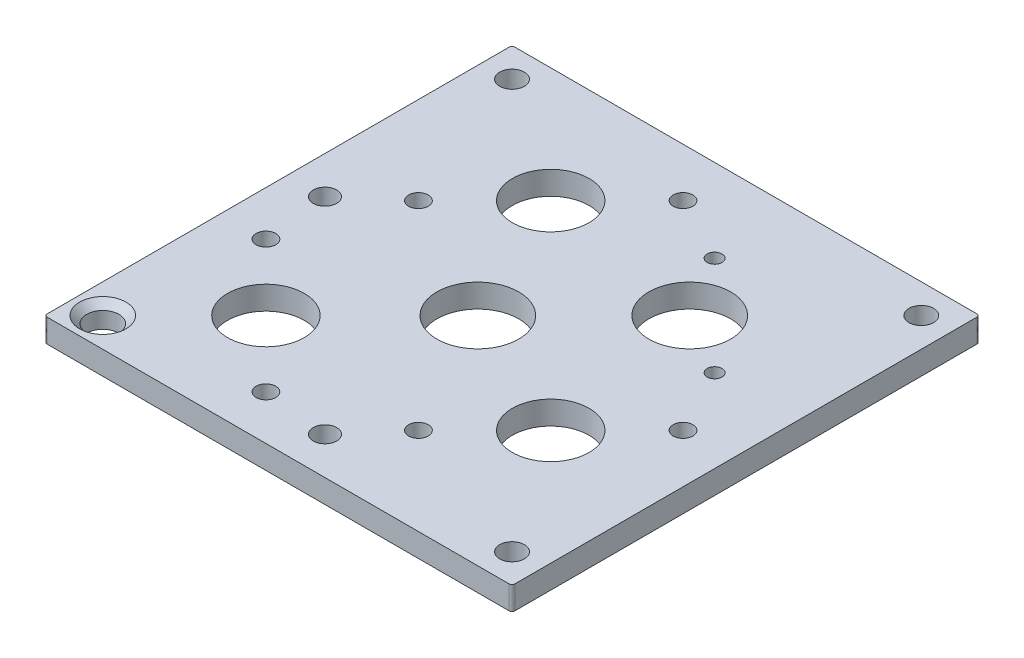
ISO-10303-21;
HEADER;
FILE_DESCRIPTION(('STEP AP214'),'2;1');
FILE_NAME('part.step','',(''),(''),'','','');
FILE_SCHEMA(('AUTOMOTIVE_DESIGN { 1 0 10303 214 1 1 1 1 }'));
ENDSEC;
DATA;
#1=APPLICATION_CONTEXT('core data for automotive mechanical design processes');
#2=APPLICATION_PROTOCOL_DEFINITION('international standard','automotive_design',2000,#1);
#3=PRODUCT_CONTEXT('',#1,'mechanical');
#4=PRODUCT('Part','Part','',(#3));
#5=PRODUCT_RELATED_PRODUCT_CATEGORY('part','',(#4));
#6=PRODUCT_DEFINITION_FORMATION('','',#4);
#7=PRODUCT_DEFINITION_CONTEXT('part definition',#1,'design');
#8=PRODUCT_DEFINITION('design','',#6,#7);
#9=PRODUCT_DEFINITION_SHAPE('','',#8);
#10=(LENGTH_UNIT() NAMED_UNIT(*) SI_UNIT(.MILLI.,.METRE.));
#11=(NAMED_UNIT(*) PLANE_ANGLE_UNIT() SI_UNIT($,.RADIAN.));
#12=(NAMED_UNIT(*) SI_UNIT($,.STERADIAN.) SOLID_ANGLE_UNIT());
#13=UNCERTAINTY_MEASURE_WITH_UNIT(LENGTH_MEASURE(1.E-05),#10,'distance_accuracy_value','');
#14=(GEOMETRIC_REPRESENTATION_CONTEXT(3) GLOBAL_UNCERTAINTY_ASSIGNED_CONTEXT((#13)) GLOBAL_UNIT_ASSIGNED_CONTEXT((#10,
#11,#12)) REPRESENTATION_CONTEXT('',''));
#15=CARTESIAN_POINT('',(0.,0.,0.));
#16=DIRECTION('',(0.,0.,1.));
#17=DIRECTION('',(1.,0.,0.));
#18=AXIS2_PLACEMENT_3D('',#15,#16,#17);
#19=CARTESIAN_POINT('',(76.3793482367758,0.762,-75.0018767002519));
#20=DIRECTION('',(0.,-1.,0.));
#21=DIRECTION('',(0.,0.,-1.));
#22=AXIS2_PLACEMENT_3D('',#19,#20,#21);
#23=PLANE('',#22);
#24=CARTESIAN_POINT('',(16.2130982367762,0.762,41.044373299748));
#25=DIRECTION('',(0.,-1.,0.));
#26=DIRECTION('',(0.,0.,-1.));
#27=AXIS2_PLACEMENT_3D('',#24,#25,#26);
#28=CIRCLE('',#27,3.175);
#29=CARTESIAN_POINT('',(16.2130982367762,0.762,37.869373299748));
#30=VERTEX_POINT('',#29);
#31=EDGE_CURVE('E633',#30,#30,#28,.F.);
#32=ORIENTED_EDGE('',*,*,#31,.F.);
#33=EDGE_LOOP('',(#32));
#34=FACE_BOUND('',#33,.T.);
#35=CARTESIAN_POINT('',(-39.6669017632242,0.762,-14.8356267002519));
#36=DIRECTION('',(0.,1.,0.));
#37=DIRECTION('',(0.,0.,1.));
#38=AXIS2_PLACEMENT_3D('',#35,#36,#37);
#39=CIRCLE('',#38,3.175);
#40=CARTESIAN_POINT('',(-39.6669017632242,0.762,-11.6606267002519));
#41=VERTEX_POINT('',#40);
#42=EDGE_CURVE('E259',#41,#41,#39,.T.);
#43=ORIENTED_EDGE('',*,*,#42,.F.);
#44=EDGE_LOOP('',(#43));
#45=FACE_BOUND('',#44,.T.);
#46=CARTESIAN_POINT('',(27.7092903566941,0.762,-53.2725871833779));
#47=DIRECTION('',(0.,-1.,0.));
#48=DIRECTION('',(0.,0.,-1.));
#49=AXIS2_PLACEMENT_3D('',#46,#47,#48);
#50=CIRCLE('',#49,2.01929999999999);
#51=CARTESIAN_POINT('',(27.7092903566941,0.762,-55.2918871833779));
#52=VERTEX_POINT('',#51);
#53=EDGE_CURVE('E120',#52,#52,#50,.T.);
#54=ORIENTED_EDGE('',*,*,#53,.T.);
#55=EDGE_LOOP('',(#54));
#56=FACE_BOUND('',#55,.T.);
#57=CARTESIAN_POINT('',(54.6500587199016,0.762,-26.3318188201704));
#58=DIRECTION('',(0.,-1.,0.));
#59=DIRECTION('',(0.,0.,-1.));
#60=AXIS2_PLACEMENT_3D('',#57,#58,#59);
#61=CIRCLE('',#60,2.01929999999999);
#62=CARTESIAN_POINT('',(54.6500587199016,0.762,-28.3511188201704));
#63=VERTEX_POINT('',#62);
#64=EDGE_CURVE('E241',#63,#63,#61,.T.);
#65=ORIENTED_EDGE('',*,*,#64,.T.);
#66=EDGE_LOOP('',(#65));
#67=FACE_BOUND('',#66,.T.);
#68=CARTESIAN_POINT('',(-1.78187074489717,0.762,39.0803667656975));
#69=DIRECTION('',(0.,-1.,0.));
#70=DIRECTION('',(0.,0.,-1.));
#71=AXIS2_PLACEMENT_3D('',#68,#69,#70);
#72=CIRCLE('',#71,2.66699999999999);
#73=CARTESIAN_POINT('',(-1.78187074489717,0.762,36.4133667656975));
#74=VERTEX_POINT('',#73);
#75=EDGE_CURVE('E238',#74,#74,#72,.T.);
#76=ORIENTED_EDGE('',*,*,#75,.T.);
#77=EDGE_LOOP('',(#76));
#78=FACE_BOUND('',#77,.T.);
#79=CARTESIAN_POINT('',(-37.7028952291736,0.762,3.15934228142071));
#80=DIRECTION('',(0.,-1.,0.));
#81=DIRECTION('',(0.,0.,-1.));
#82=AXIS2_PLACEMENT_3D('',#79,#80,#81);
#83=CIRCLE('',#82,2.667);
#84=CARTESIAN_POINT('',(-37.7028952291736,0.762,0.492342281420709));
#85=VERTEX_POINT('',#84);
#86=EDGE_CURVE('E235',#85,#85,#83,.T.);
#87=ORIENTED_EDGE('',*,*,#86,.T.);
#88=EDGE_LOOP('',(#87));
#89=FACE_BOUND('',#88,.T.);
#90=CARTESIAN_POINT('',(-19.7423829870354,0.762,21.1198545235591));
#91=DIRECTION('',(0.,-1.,0.));
#92=DIRECTION('',(0.,0.,-1.));
#93=AXIS2_PLACEMENT_3D('',#90,#91,#92);
#94=CIRCLE('',#93,10.414);
#95=CARTESIAN_POINT('',(-19.7423829870354,0.762,10.7058545235591));
#96=VERTEX_POINT('',#95);
#97=EDGE_CURVE('E232',#96,#96,#94,.T.);
#98=ORIENTED_EDGE('',*,*,#97,.T.);
#99=EDGE_LOOP('',(#98));
#100=FACE_BOUND('',#99,.T.);
#101=CARTESIAN_POINT('',(45.9439089838919,0.762,9.46818077983892));
#102=DIRECTION('',(0.,-1.,0.));
#103=DIRECTION('',(0.,0.,-1.));
#104=AXIS2_PLACEMENT_3D('',#101,#102,#103);
#105=CIRCLE('',#104,10.414);
#106=CARTESIAN_POINT('',(45.9439089838919,0.762,-0.94581922016109));
#107=VERTEX_POINT('',#106);
#108=EDGE_CURVE('E229',#107,#107,#105,.T.);
#109=ORIENTED_EDGE('',*,*,#108,.T.);
#110=EDGE_LOOP('',(#109));
#111=FACE_BOUND('',#110,.T.);
#112=CARTESIAN_POINT('',(9.86980299882346,0.762,-62.5269496895063));
#113=DIRECTION('',(0.,-1.,0.));
#114=DIRECTION('',(0.,0.,-1.));
#115=AXIS2_PLACEMENT_3D('',#112,#113,#114);
#116=CIRCLE('',#115,2.66699999999999);
#117=CARTESIAN_POINT('',(9.86980299882346,0.762,-65.1939496895063));
#118=VERTEX_POINT('',#117);
#119=EDGE_CURVE('E226',#118,#118,#116,.T.);
#120=ORIENTED_EDGE('',*,*,#119,.T.);
#121=EDGE_LOOP('',(#120));
#122=FACE_BOUND('',#121,.T.);
#123=CARTESIAN_POINT('',(-26.0512214854532,0.762,-26.6059252052298));
#124=DIRECTION('',(0.,-1.,0.));
#125=DIRECTION('',(0.,0.,-1.));
#126=AXIS2_PLACEMENT_3D('',#123,#124,#125);
#127=CIRCLE('',#126,2.66699999999998);
#128=CARTESIAN_POINT('',(-26.0512214854532,0.762,-29.2729252052298));
#129=VERTEX_POINT('',#128);
#130=EDGE_CURVE('E223',#129,#129,#127,.T.);
#131=ORIENTED_EDGE('',*,*,#130,.T.);
#132=EDGE_LOOP('',(#131));
#133=FACE_BOUND('',#132,.T.);
#134=CARTESIAN_POINT('',(-8.09070924331489,0.762,-44.5664374473681));
#135=DIRECTION('',(0.,-1.,0.));
#136=DIRECTION('',(0.,0.,-1.));
#137=AXIS2_PLACEMENT_3D('',#134,#135,#136);
#138=CIRCLE('',#137,10.414);
#139=CARTESIAN_POINT('',(-8.09070924331489,0.762,-54.9804374473681));
#140=VERTEX_POINT('',#139);
#141=EDGE_CURVE('E220',#140,#140,#138,.T.);
#142=ORIENTED_EDGE('',*,*,#141,.T.);
#143=EDGE_LOOP('',(#142));
#144=FACE_BOUND('',#143,.T.);
#145=CARTESIAN_POINT('',(27.9833967417535,0.762,27.4286930219772));
#146=DIRECTION('',(0.,-1.,0.));
#147=DIRECTION('',(0.,0.,-1.));
#148=AXIS2_PLACEMENT_3D('',#145,#146,#147);
#149=CIRCLE('',#148,2.667);
#150=CARTESIAN_POINT('',(27.9833967417535,0.762,24.7616930219772));
#151=VERTEX_POINT('',#150);
#152=EDGE_CURVE('E217',#151,#151,#149,.T.);
#153=ORIENTED_EDGE('',*,*,#152,.T.);
#154=EDGE_LOOP('',(#153));
#155=FACE_BOUND('',#154,.T.);
#156=CARTESIAN_POINT('',(37.8030982367759,0.762,-36.4256267002519));
#157=DIRECTION('',(0.,-1.,0.));
#158=DIRECTION('',(0.,0.,-1.));
#159=AXIS2_PLACEMENT_3D('',#156,#157,#158);
#160=CIRCLE('',#159,11.1125);
#161=CARTESIAN_POINT('',(37.8030982367759,0.762,-47.5381267002519));
#162=VERTEX_POINT('',#161);
#163=EDGE_CURVE('E214',#162,#162,#160,.T.);
#164=ORIENTED_EDGE('',*,*,#163,.T.);
#165=EDGE_LOOP('',(#164));
#166=FACE_BOUND('',#165,.T.);
#167=CARTESIAN_POINT('',(-41.8894017632242,0.762,-67.8581267002519));
#168=DIRECTION('',(0.,-1.,0.));
#169=DIRECTION('',(0.,0.,-1.));
#170=AXIS2_PLACEMENT_3D('',#167,#168,#169);
#171=CIRCLE('',#170,3.3528);
#172=CARTESIAN_POINT('',(-41.8894017632242,0.762,-71.2109267002519));
#173=VERTEX_POINT('',#172);
#174=EDGE_CURVE('E211',#173,#173,#171,.T.);
#175=ORIENTED_EDGE('',*,*,#174,.T.);
#176=EDGE_LOOP('',(#175));
#177=FACE_BOUND('',#176,.T.);
#178=CARTESIAN_POINT('',(69.2355982367759,0.762,43.2668732997482));
#179=DIRECTION('',(0.,-1.,0.));
#180=DIRECTION('',(0.,0.,-1.));
#181=AXIS2_PLACEMENT_3D('',#178,#179,#180);
#182=CIRCLE('',#181,3.3528);
#183=CARTESIAN_POINT('',(69.2355982367759,0.762,39.9140732997482));
#184=VERTEX_POINT('',#183);
#185=EDGE_CURVE('E208',#184,#184,#182,.T.);
#186=ORIENTED_EDGE('',*,*,#185,.T.);
#187=EDGE_LOOP('',(#186));
#188=FACE_BOUND('',#187,.T.);
#189=CARTESIAN_POINT('',(69.2355982367759,0.762,-67.8581267002519));
#190=DIRECTION('',(0.,-1.,0.));
#191=DIRECTION('',(0.,0.,-1.));
#192=AXIS2_PLACEMENT_3D('',#189,#190,#191);
#193=CIRCLE('',#192,3.3528);
#194=CARTESIAN_POINT('',(69.2355982367759,0.762,-71.2109267002519));
#195=VERTEX_POINT('',#194);
#196=EDGE_CURVE('E205',#195,#195,#193,.T.);
#197=ORIENTED_EDGE('',*,*,#196,.T.);
#198=EDGE_LOOP('',(#197));
#199=FACE_BOUND('',#198,.T.);
#200=CARTESIAN_POINT('',(9.03035762487027,0.762,-7.65288608834638));
#201=DIRECTION('',(0.,-1.,0.));
#202=DIRECTION('',(0.,0.,-1.));
#203=AXIS2_PLACEMENT_3D('',#200,#201,#202);
#204=CIRCLE('',#203,11.1125);
#205=CARTESIAN_POINT('',(9.03035762487027,0.762,-18.7653860883464));
#206=VERTEX_POINT('',#205);
#207=EDGE_CURVE('E133',#206,#206,#204,.T.);
#208=ORIENTED_EDGE('',*,*,#207,.T.);
#209=EDGE_LOOP('',(#208));
#210=FACE_BOUND('',#209,.T.);
#211=CARTESIAN_POINT('',(63.9044212260302,0.762,-8.49233146229936));
#212=DIRECTION('',(0.,-1.,0.));
#213=DIRECTION('',(0.,0.,-1.));
#214=AXIS2_PLACEMENT_3D('',#211,#212,#213);
#215=CIRCLE('',#214,2.667);
#216=CARTESIAN_POINT('',(63.9044212260302,0.762,-11.1593314622994));
#217=VERTEX_POINT('',#216);
#218=EDGE_CURVE('E130',#217,#217,#215,.T.);
#219=ORIENTED_EDGE('',*,*,#218,.T.);
#220=EDGE_LOOP('',(#219));
#221=FACE_BOUND('',#220,.T.);
#222=DIRECTION('',(-1.,0.,0.));
#223=VECTOR('',#222,1.);
#224=CARTESIAN_POINT('',(-49.0331517632242,0.762,-75.7956267002519));
#225=LINE('',#224,#223);
#226=CARTESIAN_POINT('',(-49.0331517632242,0.762,-75.7956267002519));
#227=VERTEX_POINT('',#226);
#228=CARTESIAN_POINT('',(76.3793482367758,0.762,-75.7956267002519));
#229=VERTEX_POINT('',#228);
#230=EDGE_CURVE('E141',#227,#229,#225,.F.);
#231=ORIENTED_EDGE('',*,*,#230,.F.);
#232=CARTESIAN_POINT('',(-49.0331517632242,0.762,-75.0018767002519));
#233=DIRECTION('',(0.,-1.,0.));
#234=DIRECTION('',(0.,0.,-1.));
#235=AXIS2_PLACEMENT_3D('',#232,#233,#234);
#236=CIRCLE('',#235,0.793749999999996);
#237=CARTESIAN_POINT('',(-49.8269017632242,0.762,-75.0018767002519));
#238=VERTEX_POINT('',#237);
#239=EDGE_CURVE('E247',#238,#227,#236,.T.);
#240=ORIENTED_EDGE('',*,*,#239,.F.);
#241=DIRECTION('',(0.,0.,1.));
#242=VECTOR('',#241,1.);
#243=CARTESIAN_POINT('',(-49.8269017632242,0.762,50.4233232997481));
#244=LINE('',#243,#242);
#245=CARTESIAN_POINT('',(-49.8269017632242,0.762,50.4233232997481));
#246=VERTEX_POINT('',#245);
#247=EDGE_CURVE('E144',#246,#238,#244,.F.);
#248=ORIENTED_EDGE('',*,*,#247,.F.);
#249=CARTESIAN_POINT('',(-49.0331517632241,0.762,50.4233232997481));
#250=DIRECTION('',(0.,-1.,0.));
#251=DIRECTION('',(0.,0.,-1.));
#252=AXIS2_PLACEMENT_3D('',#249,#250,#251);
#253=CIRCLE('',#252,0.793750000000024);
#254=CARTESIAN_POINT('',(-49.0331517632241,0.762,51.2170732997481));
#255=VERTEX_POINT('',#254);
#256=EDGE_CURVE('E249',#255,#246,#253,.T.);
#257=ORIENTED_EDGE('',*,*,#256,.F.);
#258=DIRECTION('',(1.,0.,0.));
#259=VECTOR('',#258,1.);
#260=CARTESIAN_POINT('',(76.3793482367759,0.762,51.2170732997481));
#261=LINE('',#260,#259);
#262=CARTESIAN_POINT('',(76.3793482367759,0.762,51.2170732997481));
#263=VERTEX_POINT('',#262);
#264=EDGE_CURVE('E149',#263,#255,#261,.F.);
#265=ORIENTED_EDGE('',*,*,#264,.F.);
#266=CARTESIAN_POINT('',(76.3793482367759,0.762,50.4233232997481));
#267=DIRECTION('',(0.,-1.,0.));
#268=DIRECTION('',(0.,0.,-1.));
#269=AXIS2_PLACEMENT_3D('',#266,#267,#268);
#270=CIRCLE('',#269,0.793749999999996);
#271=CARTESIAN_POINT('',(77.1730982367759,0.762,50.4233232997481));
#272=VERTEX_POINT('',#271);
#273=EDGE_CURVE('E106',#272,#263,#270,.T.);
#274=ORIENTED_EDGE('',*,*,#273,.F.);
#275=DIRECTION('',(0.,0.,-1.));
#276=VECTOR('',#275,1.);
#277=CARTESIAN_POINT('',(77.1730982367758,0.762,-75.0018767002519));
#278=LINE('',#277,#276);
#279=CARTESIAN_POINT('',(77.1730982367758,0.762,-75.0018767002519));
#280=VERTEX_POINT('',#279);
#281=EDGE_CURVE('E123',#280,#272,#278,.F.);
#282=ORIENTED_EDGE('',*,*,#281,.F.);
#283=CARTESIAN_POINT('',(76.3793482367758,0.762,-75.0018767002519));
#284=DIRECTION('',(0.,-1.,0.));
#285=DIRECTION('',(0.,0.,-1.));
#286=AXIS2_PLACEMENT_3D('',#283,#284,#285);
#287=CIRCLE('',#286,0.79375000000001);
#288=EDGE_CURVE('E111',#229,#280,#287,.T.);
#289=ORIENTED_EDGE('',*,*,#288,.F.);
#290=EDGE_LOOP('',(#231,#240,#248,#257,#265,#274,#282,#289));
#291=FACE_BOUND('',#290,.T.);
#292=CARTESIAN_POINT('',(-41.8894017632242,0.762,43.2668732997482));
#293=DIRECTION('',(0.,1.,0.));
#294=DIRECTION('',(0.,0.,1.));
#295=AXIS2_PLACEMENT_3D('',#292,#293,#294);
#296=CIRCLE('',#295,6.3);
#297=CARTESIAN_POINT('',(-41.8894017632242,0.762,49.5668732997482));
#298=VERTEX_POINT('',#297);
#299=EDGE_CURVE('E255',#298,#298,#296,.T.);
#300=ORIENTED_EDGE('',*,*,#299,.F.);
#301=EDGE_LOOP('',(#300));
#302=FACE_BOUND('',#301,.T.);
#303=ADVANCED_FACE('F36',(#34,#45,#56,#67,#78,#89,#100,#111,#122,#133,#144,#155,#166,#177,#188,
#199,#210,#221,#291,#302),#23,.F.);
#304=CARTESIAN_POINT('',(76.3793482367759,0.762,50.4233232997481));
#305=DIRECTION('',(0.,-1.,0.));
#306=DIRECTION('',(0.,0.,-1.));
#307=AXIS2_PLACEMENT_3D('',#304,#305,#306);
#308=CYLINDRICAL_SURFACE('',#307,0.793749999999996);
#309=ORIENTED_EDGE('',*,*,#273,.T.);
#310=DIRECTION('',(0.,1.,0.));
#311=VECTOR('',#310,1.);
#312=CARTESIAN_POINT('',(76.3793482367759,0.762,51.2170732997481));
#313=LINE('',#312,#311);
#314=CARTESIAN_POINT('',(76.3793482367759,-5.588,51.2170732997481));
#315=VERTEX_POINT('',#314);
#316=EDGE_CURVE('E140',#315,#263,#313,.T.);
#317=ORIENTED_EDGE('',*,*,#316,.F.);
#318=CARTESIAN_POINT('',(76.3793482367759,-5.588,50.4233232997481));
#319=DIRECTION('',(0.,-1.,0.));
#320=DIRECTION('',(0.,0.,-1.));
#321=AXIS2_PLACEMENT_3D('',#318,#319,#320);
#322=CIRCLE('',#321,0.793749999999996);
#323=CARTESIAN_POINT('',(77.1730982367759,-5.588,50.4233232997481));
#324=VERTEX_POINT('',#323);
#325=EDGE_CURVE('E71',#315,#324,#322,.F.);
#326=ORIENTED_EDGE('',*,*,#325,.T.);
#327=DIRECTION('',(0.,1.,0.));
#328=VECTOR('',#327,1.);
#329=CARTESIAN_POINT('',(77.1730982367759,0.762,50.4233232997481));
#330=LINE('',#329,#328);
#331=EDGE_CURVE('E126',#272,#324,#330,.F.);
#332=ORIENTED_EDGE('',*,*,#331,.F.);
#333=EDGE_LOOP('',(#309,#317,#326,#332));
#334=FACE_BOUND('',#333,.T.);
#335=ADVANCED_FACE('F38',(#334),#308,.T.);
#336=CARTESIAN_POINT('',(-49.0331517632241,0.762,50.4233232997481));
#337=DIRECTION('',(0.,-1.,0.));
#338=DIRECTION('',(0.,0.,-1.));
#339=AXIS2_PLACEMENT_3D('',#336,#337,#338);
#340=CYLINDRICAL_SURFACE('',#339,0.793750000000024);
#341=ORIENTED_EDGE('',*,*,#256,.T.);
#342=DIRECTION('',(0.,1.,0.));
#343=VECTOR('',#342,1.);
#344=CARTESIAN_POINT('',(-49.8269017632242,0.762,50.4233232997481));
#345=LINE('',#344,#343);
#346=CARTESIAN_POINT('',(-49.8269017632242,-5.588,50.4233232997481));
#347=VERTEX_POINT('',#346);
#348=EDGE_CURVE('E148',#347,#246,#345,.T.);
#349=ORIENTED_EDGE('',*,*,#348,.F.);
#350=CARTESIAN_POINT('',(-49.0331517632241,-5.588,50.4233232997481));
#351=DIRECTION('',(0.,-1.,0.));
#352=DIRECTION('',(0.,0.,-1.));
#353=AXIS2_PLACEMENT_3D('',#350,#351,#352);
#354=CIRCLE('',#353,0.793750000000024);
#355=CARTESIAN_POINT('',(-49.0331517632241,-5.588,51.2170732997481));
#356=VERTEX_POINT('',#355);
#357=EDGE_CURVE('E253',#347,#356,#354,.F.);
#358=ORIENTED_EDGE('',*,*,#357,.T.);
#359=DIRECTION('',(0.,1.,0.));
#360=VECTOR('',#359,1.);
#361=CARTESIAN_POINT('',(-49.0331517632241,0.762,51.2170732997481));
#362=LINE('',#361,#360);
#363=EDGE_CURVE('E137',#255,#356,#362,.F.);
#364=ORIENTED_EDGE('',*,*,#363,.F.);
#365=EDGE_LOOP('',(#341,#349,#358,#364));
#366=FACE_BOUND('',#365,.T.);
#367=ADVANCED_FACE('F287',(#366),#340,.T.);
#368=CARTESIAN_POINT('',(-49.0331517632242,0.762,-75.0018767002519));
#369=DIRECTION('',(0.,-1.,0.));
#370=DIRECTION('',(0.,0.,-1.));
#371=AXIS2_PLACEMENT_3D('',#368,#369,#370);
#372=CYLINDRICAL_SURFACE('',#371,0.793749999999996);
#373=ORIENTED_EDGE('',*,*,#239,.T.);
#374=DIRECTION('',(0.,1.,0.));
#375=VECTOR('',#374,1.);
#376=CARTESIAN_POINT('',(-49.0331517632242,0.762,-75.7956267002519));
#377=LINE('',#376,#375);
#378=CARTESIAN_POINT('',(-49.0331517632242,-5.588,-75.7956267002519));
#379=VERTEX_POINT('',#378);
#380=EDGE_CURVE('E143',#379,#227,#377,.T.);
#381=ORIENTED_EDGE('',*,*,#380,.F.);
#382=CARTESIAN_POINT('',(-49.0331517632242,-5.588,-75.0018767002519));
#383=DIRECTION('',(0.,-1.,0.));
#384=DIRECTION('',(0.,0.,-1.));
#385=AXIS2_PLACEMENT_3D('',#382,#383,#384);
#386=CIRCLE('',#385,0.793749999999996);
#387=CARTESIAN_POINT('',(-49.8269017632242,-5.588,-75.0018767002519));
#388=VERTEX_POINT('',#387);
#389=EDGE_CURVE('E54',#379,#388,#386,.F.);
#390=ORIENTED_EDGE('',*,*,#389,.T.);
#391=DIRECTION('',(0.,1.,0.));
#392=VECTOR('',#391,1.);
#393=CARTESIAN_POINT('',(-49.8269017632242,0.762,-75.0018767002519));
#394=LINE('',#393,#392);
#395=EDGE_CURVE('E147',#238,#388,#394,.F.);
#396=ORIENTED_EDGE('',*,*,#395,.F.);
#397=EDGE_LOOP('',(#373,#381,#390,#396));
#398=FACE_BOUND('',#397,.T.);
#399=ADVANCED_FACE('F295',(#398),#372,.T.);
#400=CARTESIAN_POINT('',(76.3793482367758,0.762,-75.0018767002519));
#401=DIRECTION('',(0.,-1.,0.));
#402=DIRECTION('',(0.,0.,-1.));
#403=AXIS2_PLACEMENT_3D('',#400,#401,#402);
#404=CYLINDRICAL_SURFACE('',#403,0.79375000000001);
#405=ORIENTED_EDGE('',*,*,#288,.T.);
#406=DIRECTION('',(0.,1.,0.));
#407=VECTOR('',#406,1.);
#408=CARTESIAN_POINT('',(77.1730982367758,0.762,-75.0018767002519));
#409=LINE('',#408,#407);
#410=CARTESIAN_POINT('',(77.1730982367758,-5.588,-75.0018767002519));
#411=VERTEX_POINT('',#410);
#412=EDGE_CURVE('E114',#411,#280,#409,.T.);
#413=ORIENTED_EDGE('',*,*,#412,.F.);
#414=CARTESIAN_POINT('',(76.3793482367758,-5.588,-75.0018767002519));
#415=DIRECTION('',(0.,-1.,0.));
#416=DIRECTION('',(0.,0.,-1.));
#417=AXIS2_PLACEMENT_3D('',#414,#415,#416);
#418=CIRCLE('',#417,0.79375000000001);
#419=CARTESIAN_POINT('',(76.3793482367758,-5.588,-75.7956267002519));
#420=VERTEX_POINT('',#419);
#421=EDGE_CURVE('E81',#411,#420,#418,.F.);
#422=ORIENTED_EDGE('',*,*,#421,.T.);
#423=DIRECTION('',(0.,1.,0.));
#424=VECTOR('',#423,1.);
#425=CARTESIAN_POINT('',(76.3793482367758,0.762,-75.7956267002519));
#426=LINE('',#425,#424);
#427=EDGE_CURVE('E117',#229,#420,#426,.F.);
#428=ORIENTED_EDGE('',*,*,#427,.F.);
#429=EDGE_LOOP('',(#405,#413,#422,#428));
#430=FACE_BOUND('',#429,.T.);
#431=ADVANCED_FACE('F112',(#430),#404,.T.);
#432=CARTESIAN_POINT('',(27.7092903566941,-5.588,-53.2725871833779));
#433=DIRECTION('',(0.,-1.,0.));
#434=DIRECTION('',(0.,0.,-1.));
#435=AXIS2_PLACEMENT_3D('',#432,#433,#434);
#436=CYLINDRICAL_SURFACE('',#435,2.01929999999999);
#437=CARTESIAN_POINT('',(27.7092903566941,-5.588,-53.2725871833779));
#438=DIRECTION('',(0.,-1.,0.));
#439=DIRECTION('',(0.,0.,-1.));
#440=AXIS2_PLACEMENT_3D('',#437,#438,#439);
#441=CIRCLE('',#440,2.01929999999999);
#442=CARTESIAN_POINT('',(27.7092903566941,-5.588,-55.2918871833779));
#443=VERTEX_POINT('',#442);
#444=EDGE_CURVE('E200',#443,#443,#441,.F.);
#445=ORIENTED_EDGE('',*,*,#444,.F.);
#446=EDGE_LOOP('',(#445));
#447=FACE_BOUND('',#446,.T.);
#448=ORIENTED_EDGE('',*,*,#53,.F.);
#449=EDGE_LOOP('',(#448));
#450=FACE_BOUND('',#449,.T.);
#451=ADVANCED_FACE('F339',(#447,#450),#436,.F.);
#452=CARTESIAN_POINT('',(54.6500587199016,-5.588,-26.3318188201704));
#453=DIRECTION('',(0.,-1.,0.));
#454=DIRECTION('',(0.,0.,-1.));
#455=AXIS2_PLACEMENT_3D('',#452,#453,#454);
#456=CYLINDRICAL_SURFACE('',#455,2.01929999999999);
#457=CARTESIAN_POINT('',(54.6500587199016,-5.588,-26.3318188201704));
#458=DIRECTION('',(0.,-1.,0.));
#459=DIRECTION('',(0.,0.,-1.));
#460=AXIS2_PLACEMENT_3D('',#457,#458,#459);
#461=CIRCLE('',#460,2.01929999999999);
#462=CARTESIAN_POINT('',(54.6500587199016,-5.588,-28.3511188201704));
#463=VERTEX_POINT('',#462);
#464=EDGE_CURVE('E197',#463,#463,#461,.F.);
#465=ORIENTED_EDGE('',*,*,#464,.F.);
#466=EDGE_LOOP('',(#465));
#467=FACE_BOUND('',#466,.T.);
#468=ORIENTED_EDGE('',*,*,#64,.F.);
#469=EDGE_LOOP('',(#468));
#470=FACE_BOUND('',#469,.T.);
#471=ADVANCED_FACE('F346',(#467,#470),#456,.F.);
#472=CARTESIAN_POINT('',(-1.78187074489717,0.762,39.0803667656975));
#473=DIRECTION('',(0.,-1.,0.));
#474=DIRECTION('',(0.,0.,-1.));
#475=AXIS2_PLACEMENT_3D('',#472,#473,#474);
#476=CYLINDRICAL_SURFACE('',#475,2.66699999999999);
#477=CARTESIAN_POINT('',(-1.78187074489717,-5.588,39.0803667656975));
#478=DIRECTION('',(0.,-1.,0.));
#479=DIRECTION('',(0.,0.,-1.));
#480=AXIS2_PLACEMENT_3D('',#477,#478,#479);
#481=CIRCLE('',#480,2.66699999999999);
#482=CARTESIAN_POINT('',(-1.78187074489717,-5.588,36.4133667656975));
#483=VERTEX_POINT('',#482);
#484=EDGE_CURVE('E194',#483,#483,#481,.F.);
#485=ORIENTED_EDGE('',*,*,#484,.F.);
#486=EDGE_LOOP('',(#485));
#487=FACE_BOUND('',#486,.T.);
#488=ORIENTED_EDGE('',*,*,#75,.F.);
#489=EDGE_LOOP('',(#488));
#490=FACE_BOUND('',#489,.T.);
#491=ADVANCED_FACE('F354',(#487,#490),#476,.F.);
#492=CARTESIAN_POINT('',(-37.7028952291736,0.762,3.15934228142071));
#493=DIRECTION('',(0.,-1.,0.));
#494=DIRECTION('',(0.,0.,-1.));
#495=AXIS2_PLACEMENT_3D('',#492,#493,#494);
#496=CYLINDRICAL_SURFACE('',#495,2.667);
#497=CARTESIAN_POINT('',(-37.7028952291736,-5.588,3.15934228142071));
#498=DIRECTION('',(0.,-1.,0.));
#499=DIRECTION('',(0.,0.,-1.));
#500=AXIS2_PLACEMENT_3D('',#497,#498,#499);
#501=CIRCLE('',#500,2.667);
#502=CARTESIAN_POINT('',(-37.7028952291736,-5.588,0.492342281420709));
#503=VERTEX_POINT('',#502);
#504=EDGE_CURVE('E191',#503,#503,#501,.F.);
#505=ORIENTED_EDGE('',*,*,#504,.F.);
#506=EDGE_LOOP('',(#505));
#507=FACE_BOUND('',#506,.T.);
#508=ORIENTED_EDGE('',*,*,#86,.F.);
#509=EDGE_LOOP('',(#508));
#510=FACE_BOUND('',#509,.T.);
#511=ADVANCED_FACE('F363',(#507,#510),#496,.F.);
#512=CARTESIAN_POINT('',(-19.7423829870354,0.762,21.1198545235591));
#513=DIRECTION('',(0.,-1.,0.));
#514=DIRECTION('',(0.,0.,-1.));
#515=AXIS2_PLACEMENT_3D('',#512,#513,#514);
#516=CYLINDRICAL_SURFACE('',#515,10.414);
#517=CARTESIAN_POINT('',(-19.7423829870354,-5.588,21.1198545235591));
#518=DIRECTION('',(0.,-1.,0.));
#519=DIRECTION('',(0.,0.,-1.));
#520=AXIS2_PLACEMENT_3D('',#517,#518,#519);
#521=CIRCLE('',#520,10.414);
#522=CARTESIAN_POINT('',(-19.7423829870354,-5.588,10.7058545235591));
#523=VERTEX_POINT('',#522);
#524=EDGE_CURVE('E188',#523,#523,#521,.F.);
#525=ORIENTED_EDGE('',*,*,#524,.F.);
#526=EDGE_LOOP('',(#525));
#527=FACE_BOUND('',#526,.T.);
#528=ORIENTED_EDGE('',*,*,#97,.F.);
#529=EDGE_LOOP('',(#528));
#530=FACE_BOUND('',#529,.T.);
#531=ADVANCED_FACE('F372',(#527,#530),#516,.F.);
#532=CARTESIAN_POINT('',(45.9439089838919,0.762,9.46818077983892));
#533=DIRECTION('',(0.,-1.,0.));
#534=DIRECTION('',(0.,0.,-1.));
#535=AXIS2_PLACEMENT_3D('',#532,#533,#534);
#536=CYLINDRICAL_SURFACE('',#535,10.414);
#537=CARTESIAN_POINT('',(45.9439089838919,-5.588,9.46818077983892));
#538=DIRECTION('',(0.,-1.,0.));
#539=DIRECTION('',(0.,0.,-1.));
#540=AXIS2_PLACEMENT_3D('',#537,#538,#539);
#541=CIRCLE('',#540,10.414);
#542=CARTESIAN_POINT('',(45.9439089838919,-5.588,-0.94581922016109));
#543=VERTEX_POINT('',#542);
#544=EDGE_CURVE('E185',#543,#543,#541,.F.);
#545=ORIENTED_EDGE('',*,*,#544,.F.);
#546=EDGE_LOOP('',(#545));
#547=FACE_BOUND('',#546,.T.);
#548=ORIENTED_EDGE('',*,*,#108,.F.);
#549=EDGE_LOOP('',(#548));
#550=FACE_BOUND('',#549,.T.);
#551=ADVANCED_FACE('F381',(#547,#550),#536,.F.);
#552=CARTESIAN_POINT('',(9.86980299882346,0.762,-62.5269496895063));
#553=DIRECTION('',(0.,-1.,0.));
#554=DIRECTION('',(0.,0.,-1.));
#555=AXIS2_PLACEMENT_3D('',#552,#553,#554);
#556=CYLINDRICAL_SURFACE('',#555,2.66699999999999);
#557=CARTESIAN_POINT('',(9.86980299882346,-5.588,-62.5269496895063));
#558=DIRECTION('',(0.,-1.,0.));
#559=DIRECTION('',(0.,0.,-1.));
#560=AXIS2_PLACEMENT_3D('',#557,#558,#559);
#561=CIRCLE('',#560,2.66699999999999);
#562=CARTESIAN_POINT('',(9.86980299882346,-5.588,-65.1939496895063));
#563=VERTEX_POINT('',#562);
#564=EDGE_CURVE('E182',#563,#563,#561,.F.);
#565=ORIENTED_EDGE('',*,*,#564,.F.);
#566=EDGE_LOOP('',(#565));
#567=FACE_BOUND('',#566,.T.);
#568=ORIENTED_EDGE('',*,*,#119,.F.);
#569=EDGE_LOOP('',(#568));
#570=FACE_BOUND('',#569,.T.);
#571=ADVANCED_FACE('F390',(#567,#570),#556,.F.);
#572=CARTESIAN_POINT('',(-26.0512214854532,0.762,-26.6059252052298));
#573=DIRECTION('',(0.,-1.,0.));
#574=DIRECTION('',(0.,0.,-1.));
#575=AXIS2_PLACEMENT_3D('',#572,#573,#574);
#576=CYLINDRICAL_SURFACE('',#575,2.66699999999998);
#577=CARTESIAN_POINT('',(-26.0512214854532,-5.588,-26.6059252052298));
#578=DIRECTION('',(0.,-1.,0.));
#579=DIRECTION('',(0.,0.,-1.));
#580=AXIS2_PLACEMENT_3D('',#577,#578,#579);
#581=CIRCLE('',#580,2.66699999999998);
#582=CARTESIAN_POINT('',(-26.0512214854532,-5.588,-29.2729252052298));
#583=VERTEX_POINT('',#582);
#584=EDGE_CURVE('E179',#583,#583,#581,.F.);
#585=ORIENTED_EDGE('',*,*,#584,.F.);
#586=EDGE_LOOP('',(#585));
#587=FACE_BOUND('',#586,.T.);
#588=ORIENTED_EDGE('',*,*,#130,.F.);
#589=EDGE_LOOP('',(#588));
#590=FACE_BOUND('',#589,.T.);
#591=ADVANCED_FACE('F399',(#587,#590),#576,.F.);
#592=CARTESIAN_POINT('',(-8.09070924331489,0.762,-44.5664374473681));
#593=DIRECTION('',(0.,-1.,0.));
#594=DIRECTION('',(0.,0.,-1.));
#595=AXIS2_PLACEMENT_3D('',#592,#593,#594);
#596=CYLINDRICAL_SURFACE('',#595,10.414);
#597=CARTESIAN_POINT('',(-8.09070924331489,-5.588,-44.5664374473681));
#598=DIRECTION('',(0.,-1.,0.));
#599=DIRECTION('',(0.,0.,-1.));
#600=AXIS2_PLACEMENT_3D('',#597,#598,#599);
#601=CIRCLE('',#600,10.414);
#602=CARTESIAN_POINT('',(-8.09070924331489,-5.588,-54.9804374473681));
#603=VERTEX_POINT('',#602);
#604=EDGE_CURVE('E176',#603,#603,#601,.F.);
#605=ORIENTED_EDGE('',*,*,#604,.F.);
#606=EDGE_LOOP('',(#605));
#607=FACE_BOUND('',#606,.T.);
#608=ORIENTED_EDGE('',*,*,#141,.F.);
#609=EDGE_LOOP('',(#608));
#610=FACE_BOUND('',#609,.T.);
#611=ADVANCED_FACE('F408',(#607,#610),#596,.F.);
#612=CARTESIAN_POINT('',(27.9833967417535,0.762,27.4286930219772));
#613=DIRECTION('',(0.,-1.,0.));
#614=DIRECTION('',(0.,0.,-1.));
#615=AXIS2_PLACEMENT_3D('',#612,#613,#614);
#616=CYLINDRICAL_SURFACE('',#615,2.667);
#617=CARTESIAN_POINT('',(27.9833967417535,-5.588,27.4286930219772));
#618=DIRECTION('',(0.,-1.,0.));
#619=DIRECTION('',(0.,0.,-1.));
#620=AXIS2_PLACEMENT_3D('',#617,#618,#619);
#621=CIRCLE('',#620,2.667);
#622=CARTESIAN_POINT('',(27.9833967417535,-5.588,24.7616930219772));
#623=VERTEX_POINT('',#622);
#624=EDGE_CURVE('E173',#623,#623,#621,.F.);
#625=ORIENTED_EDGE('',*,*,#624,.F.);
#626=EDGE_LOOP('',(#625));
#627=FACE_BOUND('',#626,.T.);
#628=ORIENTED_EDGE('',*,*,#152,.F.);
#629=EDGE_LOOP('',(#628));
#630=FACE_BOUND('',#629,.T.);
#631=ADVANCED_FACE('F417',(#627,#630),#616,.F.);
#632=CARTESIAN_POINT('',(37.8030982367759,0.762,-36.4256267002519));
#633=DIRECTION('',(0.,-1.,0.));
#634=DIRECTION('',(0.,0.,-1.));
#635=AXIS2_PLACEMENT_3D('',#632,#633,#634);
#636=CYLINDRICAL_SURFACE('',#635,11.1125);
#637=CARTESIAN_POINT('',(37.8030982367759,-5.588,-36.4256267002519));
#638=DIRECTION('',(0.,-1.,0.));
#639=DIRECTION('',(0.,0.,-1.));
#640=AXIS2_PLACEMENT_3D('',#637,#638,#639);
#641=CIRCLE('',#640,11.1125);
#642=CARTESIAN_POINT('',(37.8030982367759,-5.588,-47.5381267002519));
#643=VERTEX_POINT('',#642);
#644=EDGE_CURVE('E170',#643,#643,#641,.F.);
#645=ORIENTED_EDGE('',*,*,#644,.F.);
#646=EDGE_LOOP('',(#645));
#647=FACE_BOUND('',#646,.T.);
#648=ORIENTED_EDGE('',*,*,#163,.F.);
#649=EDGE_LOOP('',(#648));
#650=FACE_BOUND('',#649,.T.);
#651=ADVANCED_FACE('F426',(#647,#650),#636,.F.);
#652=CARTESIAN_POINT('',(-41.8894017632242,0.762,-67.8581267002519));
#653=DIRECTION('',(0.,-1.,0.));
#654=DIRECTION('',(0.,0.,-1.));
#655=AXIS2_PLACEMENT_3D('',#652,#653,#654);
#656=CYLINDRICAL_SURFACE('',#655,3.3528);
#657=CARTESIAN_POINT('',(-41.8894017632242,-5.588,-67.8581267002519));
#658=DIRECTION('',(0.,-1.,0.));
#659=DIRECTION('',(0.,0.,-1.));
#660=AXIS2_PLACEMENT_3D('',#657,#658,#659);
#661=CIRCLE('',#660,3.3528);
#662=CARTESIAN_POINT('',(-41.8894017632242,-5.588,-71.2109267002519));
#663=VERTEX_POINT('',#662);
#664=EDGE_CURVE('E167',#663,#663,#661,.F.);
#665=ORIENTED_EDGE('',*,*,#664,.F.);
#666=EDGE_LOOP('',(#665));
#667=FACE_BOUND('',#666,.T.);
#668=ORIENTED_EDGE('',*,*,#174,.F.);
#669=EDGE_LOOP('',(#668));
#670=FACE_BOUND('',#669,.T.);
#671=ADVANCED_FACE('F435',(#667,#670),#656,.F.);
#672=CARTESIAN_POINT('',(69.2355982367759,0.762,43.2668732997482));
#673=DIRECTION('',(0.,-1.,0.));
#674=DIRECTION('',(0.,0.,-1.));
#675=AXIS2_PLACEMENT_3D('',#672,#673,#674);
#676=CYLINDRICAL_SURFACE('',#675,3.3528);
#677=CARTESIAN_POINT('',(69.2355982367759,-5.588,43.2668732997482));
#678=DIRECTION('',(0.,-1.,0.));
#679=DIRECTION('',(0.,0.,-1.));
#680=AXIS2_PLACEMENT_3D('',#677,#678,#679);
#681=CIRCLE('',#680,3.3528);
#682=CARTESIAN_POINT('',(69.2355982367759,-5.588,39.9140732997482));
#683=VERTEX_POINT('',#682);
#684=EDGE_CURVE('E164',#683,#683,#681,.F.);
#685=ORIENTED_EDGE('',*,*,#684,.F.);
#686=EDGE_LOOP('',(#685));
#687=FACE_BOUND('',#686,.T.);
#688=ORIENTED_EDGE('',*,*,#185,.F.);
#689=EDGE_LOOP('',(#688));
#690=FACE_BOUND('',#689,.T.);
#691=ADVANCED_FACE('F444',(#687,#690),#676,.F.);
#692=CARTESIAN_POINT('',(69.2355982367759,0.762,-67.8581267002519));
#693=DIRECTION('',(0.,-1.,0.));
#694=DIRECTION('',(0.,0.,-1.));
#695=AXIS2_PLACEMENT_3D('',#692,#693,#694);
#696=CYLINDRICAL_SURFACE('',#695,3.3528);
#697=CARTESIAN_POINT('',(69.2355982367759,-5.588,-67.8581267002519));
#698=DIRECTION('',(0.,-1.,0.));
#699=DIRECTION('',(0.,0.,-1.));
#700=AXIS2_PLACEMENT_3D('',#697,#698,#699);
#701=CIRCLE('',#700,3.3528);
#702=CARTESIAN_POINT('',(69.2355982367759,-5.588,-71.2109267002519));
#703=VERTEX_POINT('',#702);
#704=EDGE_CURVE('E161',#703,#703,#701,.F.);
#705=ORIENTED_EDGE('',*,*,#704,.F.);
#706=EDGE_LOOP('',(#705));
#707=FACE_BOUND('',#706,.T.);
#708=ORIENTED_EDGE('',*,*,#196,.F.);
#709=EDGE_LOOP('',(#708));
#710=FACE_BOUND('',#709,.T.);
#711=ADVANCED_FACE('F453',(#707,#710),#696,.F.);
#712=CARTESIAN_POINT('',(9.03035762487027,0.762,-7.65288608834638));
#713=DIRECTION('',(0.,-1.,0.));
#714=DIRECTION('',(0.,0.,-1.));
#715=AXIS2_PLACEMENT_3D('',#712,#713,#714);
#716=CYLINDRICAL_SURFACE('',#715,11.1125);
#717=CARTESIAN_POINT('',(9.03035762487027,-5.588,-7.65288608834638));
#718=DIRECTION('',(0.,-1.,0.));
#719=DIRECTION('',(0.,0.,-1.));
#720=AXIS2_PLACEMENT_3D('',#717,#718,#719);
#721=CIRCLE('',#720,11.1125);
#722=CARTESIAN_POINT('',(9.03035762487027,-5.588,-18.7653860883464));
#723=VERTEX_POINT('',#722);
#724=EDGE_CURVE('E158',#723,#723,#721,.F.);
#725=ORIENTED_EDGE('',*,*,#724,.F.);
#726=EDGE_LOOP('',(#725));
#727=FACE_BOUND('',#726,.T.);
#728=ORIENTED_EDGE('',*,*,#207,.F.);
#729=EDGE_LOOP('',(#728));
#730=FACE_BOUND('',#729,.T.);
#731=ADVANCED_FACE('F462',(#727,#730),#716,.F.);
#732=CARTESIAN_POINT('',(-41.8894017632242,0.762,43.2668732997482));
#733=DIRECTION('',(0.,-1.,0.));
#734=DIRECTION('',(0.,0.,-1.));
#735=AXIS2_PLACEMENT_3D('',#732,#733,#734);
#736=CYLINDRICAL_SURFACE('',#735,4.3815);
#737=CARTESIAN_POINT('',(-41.8894017632242,-1.15650000000001,43.2668732997482));
#738=DIRECTION('',(0.,1.,0.));
#739=DIRECTION('',(0.,0.,1.));
#740=AXIS2_PLACEMENT_3D('',#737,#738,#739);
#741=CIRCLE('',#740,4.3815);
#742=CARTESIAN_POINT('',(-41.8894017632242,-1.15650000000001,47.6483732997482));
#743=VERTEX_POINT('',#742);
#744=EDGE_CURVE('E40',#743,#743,#741,.T.);
#745=ORIENTED_EDGE('',*,*,#744,.T.);
#746=EDGE_LOOP('',(#745));
#747=FACE_BOUND('',#746,.T.);
#748=CARTESIAN_POINT('',(-41.8894017632242,-5.588,43.2668732997482));
#749=DIRECTION('',(0.,-1.,0.));
#750=DIRECTION('',(0.,0.,-1.));
#751=AXIS2_PLACEMENT_3D('',#748,#749,#750);
#752=CIRCLE('',#751,4.3815);
#753=CARTESIAN_POINT('',(-41.8894017632242,-5.588,38.8853732997482));
#754=VERTEX_POINT('',#753);
#755=EDGE_CURVE('E155',#754,#754,#752,.F.);
#756=ORIENTED_EDGE('',*,*,#755,.F.);
#757=EDGE_LOOP('',(#756));
#758=FACE_BOUND('',#757,.T.);
#759=ADVANCED_FACE('F471',(#747,#758),#736,.F.);
#760=CARTESIAN_POINT('',(63.9044212260302,0.762,-8.49233146229936));
#761=DIRECTION('',(0.,-1.,0.));
#762=DIRECTION('',(0.,0.,-1.));
#763=AXIS2_PLACEMENT_3D('',#760,#761,#762);
#764=CYLINDRICAL_SURFACE('',#763,2.667);
#765=CARTESIAN_POINT('',(63.9044212260302,-5.588,-8.49233146229936));
#766=DIRECTION('',(0.,-1.,0.));
#767=DIRECTION('',(0.,0.,-1.));
#768=AXIS2_PLACEMENT_3D('',#765,#766,#767);
#769=CIRCLE('',#768,2.667);
#770=CARTESIAN_POINT('',(63.9044212260302,-5.588,-11.1593314622994));
#771=VERTEX_POINT('',#770);
#772=EDGE_CURVE('E152',#771,#771,#769,.F.);
#773=ORIENTED_EDGE('',*,*,#772,.F.);
#774=EDGE_LOOP('',(#773));
#775=FACE_BOUND('',#774,.T.);
#776=ORIENTED_EDGE('',*,*,#218,.F.);
#777=EDGE_LOOP('',(#776));
#778=FACE_BOUND('',#777,.T.);
#779=ADVANCED_FACE('F481',(#775,#778),#764,.F.);
#780=CARTESIAN_POINT('',(77.1730982367758,0.762,-75.0018767002519));
#781=DIRECTION('',(1.,0.,0.));
#782=DIRECTION('',(0.,0.,-1.));
#783=AXIS2_PLACEMENT_3D('',#780,#781,#782);
#784=PLANE('',#783);
#785=ORIENTED_EDGE('',*,*,#281,.T.);
#786=ORIENTED_EDGE('',*,*,#331,.T.);
#787=DIRECTION('',(0.,0.,-1.));
#788=VECTOR('',#787,1.);
#789=CARTESIAN_POINT('',(77.1730982367758,-5.588,-75.0018767002519));
#790=LINE('',#789,#788);
#791=EDGE_CURVE('E129',#411,#324,#790,.F.);
#792=ORIENTED_EDGE('',*,*,#791,.F.);
#793=ORIENTED_EDGE('',*,*,#412,.T.);
#794=EDGE_LOOP('',(#785,#786,#792,#793));
#795=FACE_BOUND('',#794,.T.);
#796=ADVANCED_FACE('F128',(#795),#784,.T.);
#797=CARTESIAN_POINT('',(76.3793482367759,0.762,51.2170732997481));
#798=DIRECTION('',(0.,0.,1.));
#799=DIRECTION('',(1.,0.,0.));
#800=AXIS2_PLACEMENT_3D('',#797,#798,#799);
#801=PLANE('',#800);
#802=ORIENTED_EDGE('',*,*,#264,.T.);
#803=ORIENTED_EDGE('',*,*,#363,.T.);
#804=DIRECTION('',(1.,0.,0.));
#805=VECTOR('',#804,1.);
#806=CARTESIAN_POINT('',(76.3793482367758,-5.588,51.2170732997481));
#807=LINE('',#806,#805);
#808=EDGE_CURVE('E269',#315,#356,#807,.F.);
#809=ORIENTED_EDGE('',*,*,#808,.F.);
#810=ORIENTED_EDGE('',*,*,#316,.T.);
#811=EDGE_LOOP('',(#802,#803,#809,#810));
#812=FACE_BOUND('',#811,.T.);
#813=ADVANCED_FACE('F281',(#812),#801,.T.);
#814=CARTESIAN_POINT('',(-49.8269017632242,0.762,50.4233232997481));
#815=DIRECTION('',(-1.,0.,0.));
#816=DIRECTION('',(0.,0.,1.));
#817=AXIS2_PLACEMENT_3D('',#814,#815,#816);
#818=PLANE('',#817);
#819=ORIENTED_EDGE('',*,*,#247,.T.);
#820=ORIENTED_EDGE('',*,*,#395,.T.);
#821=DIRECTION('',(0.,0.,-1.));
#822=VECTOR('',#821,1.);
#823=CARTESIAN_POINT('',(-49.8269017632242,-5.588,-75.0018767002519));
#824=LINE('',#823,#822);
#825=EDGE_CURVE('E46',#347,#388,#824,.T.);
#826=ORIENTED_EDGE('',*,*,#825,.F.);
#827=ORIENTED_EDGE('',*,*,#348,.T.);
#828=EDGE_LOOP('',(#819,#820,#826,#827));
#829=FACE_BOUND('',#828,.T.);
#830=ADVANCED_FACE('F292',(#829),#818,.T.);
#831=CARTESIAN_POINT('',(-49.0331517632242,0.762,-75.7956267002519));
#832=DIRECTION('',(0.,0.,-1.));
#833=DIRECTION('',(-1.,0.,0.));
#834=AXIS2_PLACEMENT_3D('',#831,#832,#833);
#835=PLANE('',#834);
#836=ORIENTED_EDGE('',*,*,#230,.T.);
#837=ORIENTED_EDGE('',*,*,#427,.T.);
#838=DIRECTION('',(1.,0.,0.));
#839=VECTOR('',#838,1.);
#840=CARTESIAN_POINT('',(76.3793482367758,-5.588,-75.7956267002519));
#841=LINE('',#840,#839);
#842=EDGE_CURVE('E11',#379,#420,#841,.T.);
#843=ORIENTED_EDGE('',*,*,#842,.F.);
#844=ORIENTED_EDGE('',*,*,#380,.T.);
#845=EDGE_LOOP('',(#836,#837,#843,#844));
#846=FACE_BOUND('',#845,.T.);
#847=ADVANCED_FACE('F298',(#846),#835,.T.);
#848=CARTESIAN_POINT('',(76.3793482367758,-5.588,-75.0018767002519));
#849=DIRECTION('',(0.,-1.,0.));
#850=DIRECTION('',(0.,0.,-1.));
#851=AXIS2_PLACEMENT_3D('',#848,#849,#850);
#852=PLANE('',#851);
#853=CARTESIAN_POINT('',(16.2130982367762,-5.588,41.044373299748));
#854=DIRECTION('',(0.,-1.,0.));
#855=DIRECTION('',(0.,0.,-1.));
#856=AXIS2_PLACEMENT_3D('',#853,#854,#855);
#857=CIRCLE('',#856,3.175);
#858=CARTESIAN_POINT('',(16.2130982367762,-5.588,37.869373299748));
#859=VERTEX_POINT('',#858);
#860=EDGE_CURVE('E635',#859,#859,#857,.T.);
#861=ORIENTED_EDGE('',*,*,#860,.F.);
#862=EDGE_LOOP('',(#861));
#863=FACE_BOUND('',#862,.T.);
#864=CARTESIAN_POINT('',(-39.6669017632242,-5.588,-14.8356267002519));
#865=DIRECTION('',(0.,-1.,0.));
#866=DIRECTION('',(0.,0.,-1.));
#867=AXIS2_PLACEMENT_3D('',#864,#865,#866);
#868=CIRCLE('',#867,3.175);
#869=CARTESIAN_POINT('',(-39.6669017632242,-5.588,-18.0106267002519));
#870=VERTEX_POINT('',#869);
#871=EDGE_CURVE('E264',#870,#870,#868,.F.);
#872=ORIENTED_EDGE('',*,*,#871,.T.);
#873=EDGE_LOOP('',(#872));
#874=FACE_BOUND('',#873,.T.);
#875=ORIENTED_EDGE('',*,*,#389,.F.);
#876=ORIENTED_EDGE('',*,*,#842,.T.);
#877=ORIENTED_EDGE('',*,*,#421,.F.);
#878=ORIENTED_EDGE('',*,*,#791,.T.);
#879=ORIENTED_EDGE('',*,*,#325,.F.);
#880=ORIENTED_EDGE('',*,*,#808,.T.);
#881=ORIENTED_EDGE('',*,*,#357,.F.);
#882=ORIENTED_EDGE('',*,*,#825,.T.);
#883=EDGE_LOOP('',(#875,#876,#877,#878,#879,#880,#881,#882));
#884=FACE_BOUND('',#883,.T.);
#885=ORIENTED_EDGE('',*,*,#772,.T.);
#886=EDGE_LOOP('',(#885));
#887=FACE_BOUND('',#886,.T.);
#888=ORIENTED_EDGE('',*,*,#755,.T.);
#889=EDGE_LOOP('',(#888));
#890=FACE_BOUND('',#889,.T.);
#891=ORIENTED_EDGE('',*,*,#724,.T.);
#892=EDGE_LOOP('',(#891));
#893=FACE_BOUND('',#892,.T.);
#894=ORIENTED_EDGE('',*,*,#704,.T.);
#895=EDGE_LOOP('',(#894));
#896=FACE_BOUND('',#895,.T.);
#897=ORIENTED_EDGE('',*,*,#684,.T.);
#898=EDGE_LOOP('',(#897));
#899=FACE_BOUND('',#898,.T.);
#900=ORIENTED_EDGE('',*,*,#664,.T.);
#901=EDGE_LOOP('',(#900));
#902=FACE_BOUND('',#901,.T.);
#903=ORIENTED_EDGE('',*,*,#644,.T.);
#904=EDGE_LOOP('',(#903));
#905=FACE_BOUND('',#904,.T.);
#906=ORIENTED_EDGE('',*,*,#624,.T.);
#907=EDGE_LOOP('',(#906));
#908=FACE_BOUND('',#907,.T.);
#909=ORIENTED_EDGE('',*,*,#604,.T.);
#910=EDGE_LOOP('',(#909));
#911=FACE_BOUND('',#910,.T.);
#912=ORIENTED_EDGE('',*,*,#584,.T.);
#913=EDGE_LOOP('',(#912));
#914=FACE_BOUND('',#913,.T.);
#915=ORIENTED_EDGE('',*,*,#564,.T.);
#916=EDGE_LOOP('',(#915));
#917=FACE_BOUND('',#916,.T.);
#918=ORIENTED_EDGE('',*,*,#544,.T.);
#919=EDGE_LOOP('',(#918));
#920=FACE_BOUND('',#919,.T.);
#921=ORIENTED_EDGE('',*,*,#524,.T.);
#922=EDGE_LOOP('',(#921));
#923=FACE_BOUND('',#922,.T.);
#924=ORIENTED_EDGE('',*,*,#504,.T.);
#925=EDGE_LOOP('',(#924));
#926=FACE_BOUND('',#925,.T.);
#927=ORIENTED_EDGE('',*,*,#484,.T.);
#928=EDGE_LOOP('',(#927));
#929=FACE_BOUND('',#928,.T.);
#930=ORIENTED_EDGE('',*,*,#464,.T.);
#931=EDGE_LOOP('',(#930));
#932=FACE_BOUND('',#931,.T.);
#933=ORIENTED_EDGE('',*,*,#444,.T.);
#934=EDGE_LOOP('',(#933));
#935=FACE_BOUND('',#934,.T.);
#936=ADVANCED_FACE('F288',(#863,#874,#884,#887,#890,#893,#896,#899,#902,#905,#908,#911,#914,
#917,#920,#923,#926,#929,#932,#935),#852,.T.);
#937=CARTESIAN_POINT('',(-41.8894017632242,0.762,43.2668732997482));
#938=DIRECTION('',(0.,1.,0.));
#939=DIRECTION('',(0.,0.,1.));
#940=AXIS2_PLACEMENT_3D('',#937,#938,#939);
#941=CONICAL_SURFACE('',#940,6.3,0.785398163397448);
#942=ORIENTED_EDGE('',*,*,#299,.T.);
#943=EDGE_LOOP('',(#942));
#944=FACE_BOUND('',#943,.T.);
#945=ORIENTED_EDGE('',*,*,#744,.F.);
#946=EDGE_LOOP('',(#945));
#947=FACE_BOUND('',#946,.T.);
#948=ADVANCED_FACE('F305',(#944,#947),#941,.F.);
#949=CARTESIAN_POINT('',(-39.6669017632242,-5.589,-14.8356267002519));
#950=DIRECTION('',(0.,1.,0.));
#951=DIRECTION('',(0.,0.,1.));
#952=AXIS2_PLACEMENT_3D('',#949,#950,#951);
#953=CYLINDRICAL_SURFACE('',#952,3.175);
#954=ORIENTED_EDGE('',*,*,#871,.F.);
#955=EDGE_LOOP('',(#954));
#956=FACE_BOUND('',#955,.T.);
#957=ORIENTED_EDGE('',*,*,#42,.T.);
#958=EDGE_LOOP('',(#957));
#959=FACE_BOUND('',#958,.T.);
#960=ADVANCED_FACE('F532',(#956,#959),#953,.F.);
#961=CARTESIAN_POINT('',(16.2130982367762,0.763,41.044373299748));
#962=DIRECTION('',(0.,-1.,0.));
#963=DIRECTION('',(0.,0.,-1.));
#964=AXIS2_PLACEMENT_3D('',#961,#962,#963);
#965=CYLINDRICAL_SURFACE('',#964,3.175);
#966=ORIENTED_EDGE('',*,*,#860,.T.);
#967=EDGE_LOOP('',(#966));
#968=FACE_BOUND('',#967,.T.);
#969=ORIENTED_EDGE('',*,*,#31,.T.);
#970=EDGE_LOOP('',(#969));
#971=FACE_BOUND('',#970,.T.);
#972=ADVANCED_FACE('F528',(#968,#971),#965,.F.);
#973=CLOSED_SHELL('',(#303,#335,#367,#399,#431,#451,#471,#491,#511,#531,#551,#571,#591,#611,
#631,#651,#671,#691,#711,#731,#759,#779,#796,#813,#830,#847,#936,#948,#960,#972));
#974=MANIFOLD_SOLID_BREP('B2',#973);
#975=ADVANCED_BREP_SHAPE_REPRESENTATION('',(#18,#974),#14);
#976=SHAPE_DEFINITION_REPRESENTATION(#9,#975);
ENDSEC;
END-ISO-10303-21;
